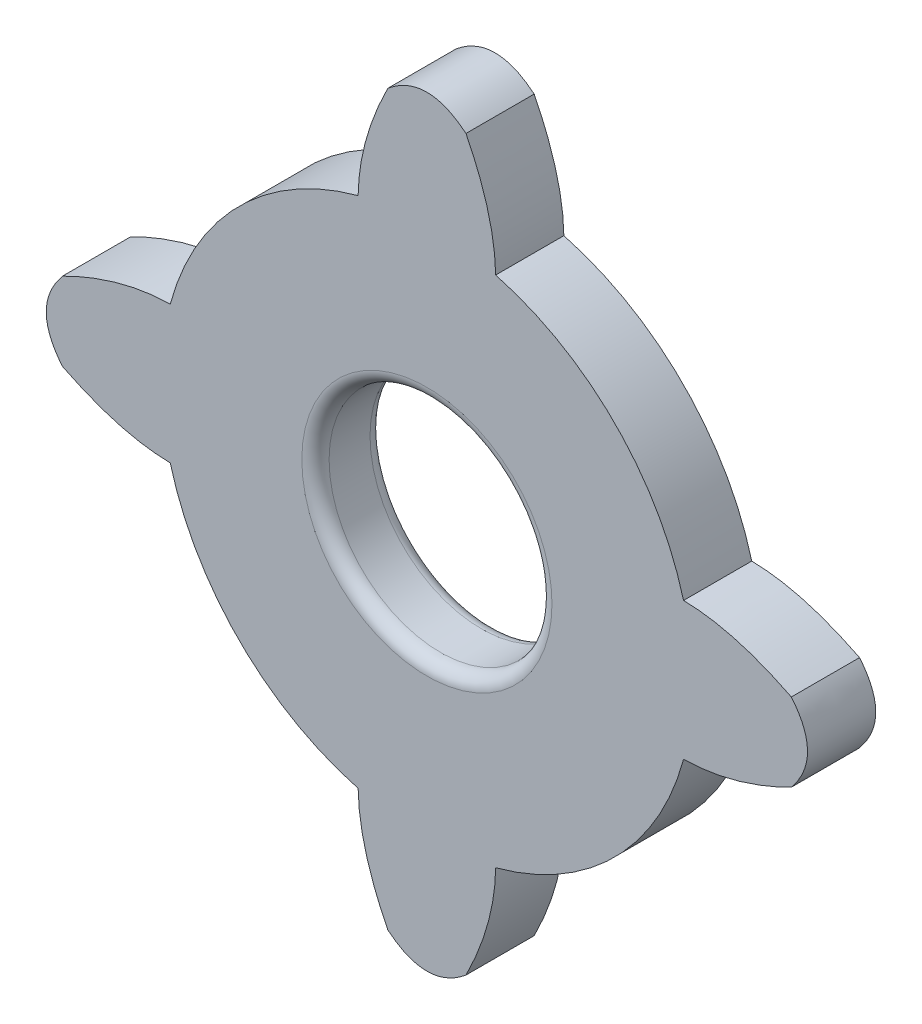
ISO-10303-21;
HEADER;
FILE_DESCRIPTION(('STEP AP214'),'2;1');
FILE_NAME('part.step','',(''),(''),'','','');
FILE_SCHEMA(('AUTOMOTIVE_DESIGN { 1 0 10303 214 1 1 1 1 }'));
ENDSEC;
DATA;
#1=APPLICATION_CONTEXT('core data for automotive mechanical design processes');
#2=APPLICATION_PROTOCOL_DEFINITION('international standard','automotive_design',2000,#1);
#3=PRODUCT_CONTEXT('',#1,'mechanical');
#4=PRODUCT('Part','Part','',(#3));
#5=PRODUCT_RELATED_PRODUCT_CATEGORY('part','',(#4));
#6=PRODUCT_DEFINITION_FORMATION('','',#4);
#7=PRODUCT_DEFINITION_CONTEXT('part definition',#1,'design');
#8=PRODUCT_DEFINITION('design','',#6,#7);
#9=PRODUCT_DEFINITION_SHAPE('','',#8);
#10=(LENGTH_UNIT() NAMED_UNIT(*) SI_UNIT(.MILLI.,.METRE.));
#11=(NAMED_UNIT(*) PLANE_ANGLE_UNIT() SI_UNIT($,.RADIAN.));
#12=(NAMED_UNIT(*) SI_UNIT($,.STERADIAN.) SOLID_ANGLE_UNIT());
#13=UNCERTAINTY_MEASURE_WITH_UNIT(LENGTH_MEASURE(1.E-05),#10,'distance_accuracy_value','');
#14=(GEOMETRIC_REPRESENTATION_CONTEXT(3) GLOBAL_UNCERTAINTY_ASSIGNED_CONTEXT((#13)) GLOBAL_UNIT_ASSIGNED_CONTEXT((#10,
#11,#12)) REPRESENTATION_CONTEXT('',''));
#15=CARTESIAN_POINT('',(0.,0.,0.));
#16=DIRECTION('',(0.,0.,1.));
#17=DIRECTION('',(1.,0.,0.));
#18=AXIS2_PLACEMENT_3D('',#15,#16,#17);
#19=CARTESIAN_POINT('',(0.,0.,8.));
#20=DIRECTION('',(0.,0.,-1.));
#21=DIRECTION('',(-1.,0.,0.));
#22=AXIS2_PLACEMENT_3D('',#19,#20,#21);
#23=TOROIDAL_SURFACE('',#22,18.3420336323127,2.);
#24=CARTESIAN_POINT('',(0.,0.,10.));
#25=DIRECTION('',(0.,0.,-1.));
#26=DIRECTION('',(-1.,0.,0.));
#27=AXIS2_PLACEMENT_3D('',#24,#25,#26);
#28=CIRCLE('',#27,18.3420336323127);
#29=CARTESIAN_POINT('',(-18.3420336323127,0.,10.));
#30=VERTEX_POINT('',#29);
#31=EDGE_CURVE('E43',#30,#30,#28,.T.);
#32=ORIENTED_EDGE('',*,*,#31,.F.);
#33=EDGE_LOOP('',(#32));
#34=FACE_BOUND('',#33,.T.);
#35=CARTESIAN_POINT('',(0.,0.,8.));
#36=DIRECTION('',(0.,0.,-1.));
#37=DIRECTION('',(-1.,0.,0.));
#38=AXIS2_PLACEMENT_3D('',#35,#36,#37);
#39=CIRCLE('',#38,16.3420336323127);
#40=CARTESIAN_POINT('',(-16.3420336323127,0.,8.));
#41=VERTEX_POINT('',#40);
#42=EDGE_CURVE('E11',#41,#41,#39,.F.);
#43=ORIENTED_EDGE('',*,*,#42,.F.);
#44=EDGE_LOOP('',(#43));
#45=FACE_BOUND('',#44,.T.);
#46=ADVANCED_FACE('F35',(#34,#45),#23,.T.);
#47=CARTESIAN_POINT('',(0.,0.,2.));
#48=DIRECTION('',(0.,0.,-1.));
#49=DIRECTION('',(-1.,0.,0.));
#50=AXIS2_PLACEMENT_3D('',#47,#48,#49);
#51=TOROIDAL_SURFACE('',#50,18.3420336323127,2.);
#52=CARTESIAN_POINT('',(0.,0.,0.));
#53=DIRECTION('',(0.,0.,-1.));
#54=DIRECTION('',(-1.,0.,0.));
#55=AXIS2_PLACEMENT_3D('',#52,#53,#54);
#56=CIRCLE('',#55,18.3420336323127);
#57=CARTESIAN_POINT('',(-18.3420336323127,0.,0.));
#58=VERTEX_POINT('',#57);
#59=EDGE_CURVE('E377',#58,#58,#56,.F.);
#60=ORIENTED_EDGE('',*,*,#59,.F.);
#61=EDGE_LOOP('',(#60));
#62=FACE_BOUND('',#61,.T.);
#63=CARTESIAN_POINT('',(0.,0.,2.));
#64=DIRECTION('',(0.,0.,-1.));
#65=DIRECTION('',(-1.,0.,0.));
#66=AXIS2_PLACEMENT_3D('',#63,#64,#65);
#67=CIRCLE('',#66,16.3420336323127);
#68=CARTESIAN_POINT('',(-16.3420336323127,0.,2.));
#69=VERTEX_POINT('',#68);
#70=EDGE_CURVE('E380',#69,#69,#67,.T.);
#71=ORIENTED_EDGE('',*,*,#70,.F.);
#72=EDGE_LOOP('',(#71));
#73=FACE_BOUND('',#72,.T.);
#74=ADVANCED_FACE('F318',(#62,#73),#51,.T.);
#75=CARTESIAN_POINT('',(-8.94182744697967,45.2711424794401,10.));
#76=DIRECTION('',(0.,0.,-1.));
#77=DIRECTION('',(-1.,0.,0.));
#78=AXIS2_PLACEMENT_3D('',#75,#76,#77);
#79=PLANE('',#78);
#80=ORIENTED_EDGE('',*,*,#31,.T.);
#81=EDGE_LOOP('',(#80));
#82=FACE_BOUND('',#81,.T.);
#83=CARTESIAN_POINT('',(-5.73037982205596,53.4351143016469,10.));
#84=CARTESIAN_POINT('',(-9.97699774629384,45.0097159362313,10.));
#85=CARTESIAN_POINT('',(-10.0829344732751,37.6300237436507,10.));
#86=B_SPLINE_CURVE_WITH_KNOTS('',2,(#83,#84,#85),.UNSPECIFIED.,.F.,.F.,(3,3),(0.,1.),.UNSPECIFIED.);
#87=CARTESIAN_POINT('',(-5.73037982205596,53.4351143016469,10.));
#88=VERTEX_POINT('',#87);
#89=CARTESIAN_POINT('',(-10.0829344732751,37.6300237436507,10.));
#90=VERTEX_POINT('',#89);
#91=EDGE_CURVE('E319',#88,#90,#86,.T.);
#92=ORIENTED_EDGE('',*,*,#91,.T.);
#93=CARTESIAN_POINT('',(0.,0.,10.));
#94=DIRECTION('',(0.,0.,1.));
#95=DIRECTION('',(1.,0.,0.));
#96=AXIS2_PLACEMENT_3D('',#93,#94,#95);
#97=CIRCLE('',#96,38.9574672500674);
#98=CARTESIAN_POINT('',(-37.6300237436507,10.0829344732751,10.));
#99=VERTEX_POINT('',#98);
#100=EDGE_CURVE('E119',#90,#99,#97,.T.);
#101=ORIENTED_EDGE('',*,*,#100,.T.);
#102=CARTESIAN_POINT('',(-37.6300237436507,10.0829344732751,10.));
#103=CARTESIAN_POINT('',(-45.0097159362313,9.97699774629384,10.));
#104=CARTESIAN_POINT('',(-53.4351143016469,5.73037982205596,10.));
#105=B_SPLINE_CURVE_WITH_KNOTS('',2,(#102,#103,#104),.UNSPECIFIED.,.F.,.F.,(3,3),(0.,1.),.UNSPECIFIED.);
#106=CARTESIAN_POINT('',(-53.4351143016469,5.73037982205596,10.));
#107=VERTEX_POINT('',#106);
#108=EDGE_CURVE('E295',#99,#107,#105,.T.);
#109=ORIENTED_EDGE('',*,*,#108,.T.);
#110=CARTESIAN_POINT('',(-53.4351143016469,5.73037982205596,10.));
#111=CARTESIAN_POINT('',(-58.1785357397927,0.,10.));
#112=CARTESIAN_POINT('',(-53.4351143016469,-5.73037982205595,10.));
#113=B_SPLINE_CURVE_WITH_KNOTS('',2,(#110,#111,#112),.UNSPECIFIED.,.F.,.F.,(3,3),(0.,1.),.UNSPECIFIED.);
#114=CARTESIAN_POINT('',(-53.4351143016469,-5.73037982205595,10.));
#115=VERTEX_POINT('',#114);
#116=EDGE_CURVE('E287',#107,#115,#113,.T.);
#117=ORIENTED_EDGE('',*,*,#116,.T.);
#118=CARTESIAN_POINT('',(-53.4351143016469,-5.73037982205595,10.));
#119=CARTESIAN_POINT('',(-45.0097159362313,-9.97699774629384,10.));
#120=CARTESIAN_POINT('',(-37.6300237436507,-10.0829344732751,10.));
#121=B_SPLINE_CURVE_WITH_KNOTS('',2,(#118,#119,#120),.UNSPECIFIED.,.F.,.F.,(3,3),(0.,1.),.UNSPECIFIED.);
#122=CARTESIAN_POINT('',(-37.6300237436507,-10.082934473275,10.));
#123=VERTEX_POINT('',#122);
#124=EDGE_CURVE('E283',#115,#123,#121,.T.);
#125=ORIENTED_EDGE('',*,*,#124,.T.);
#126=CARTESIAN_POINT('',(0.,0.,10.));
#127=DIRECTION('',(0.,0.,1.));
#128=DIRECTION('',(1.,0.,0.));
#129=AXIS2_PLACEMENT_3D('',#126,#127,#128);
#130=CIRCLE('',#129,38.9574672500674);
#131=CARTESIAN_POINT('',(-10.0829344732751,-37.6300237436507,10.));
#132=VERTEX_POINT('',#131);
#133=EDGE_CURVE('E263',#123,#132,#130,.T.);
#134=ORIENTED_EDGE('',*,*,#133,.T.);
#135=CARTESIAN_POINT('',(-10.0829344732751,-37.6300237436507,10.));
#136=CARTESIAN_POINT('',(-9.97699774629383,-45.0097159362313,10.));
#137=CARTESIAN_POINT('',(-5.73037982205595,-53.4351143016469,10.));
#138=B_SPLINE_CURVE_WITH_KNOTS('',2,(#135,#136,#137),.UNSPECIFIED.,.F.,.F.,(3,3),(0.,1.),.UNSPECIFIED.);
#139=CARTESIAN_POINT('',(-5.73037982205595,-53.4351143016469,10.));
#140=VERTEX_POINT('',#139);
#141=EDGE_CURVE('E255',#132,#140,#138,.T.);
#142=ORIENTED_EDGE('',*,*,#141,.T.);
#143=CARTESIAN_POINT('',(-5.73037982205595,-53.4351143016469,10.));
#144=CARTESIAN_POINT('',(0.,-58.1785357397927,10.));
#145=CARTESIAN_POINT('',(5.73037982205597,-53.4351143016469,10.));
#146=B_SPLINE_CURVE_WITH_KNOTS('',2,(#143,#144,#145),.UNSPECIFIED.,.F.,.F.,(3,3),(0.,1.),.UNSPECIFIED.);
#147=CARTESIAN_POINT('',(5.73037982205597,-53.4351143016469,10.));
#148=VERTEX_POINT('',#147);
#149=EDGE_CURVE('E247',#140,#148,#146,.T.);
#150=ORIENTED_EDGE('',*,*,#149,.T.);
#151=CARTESIAN_POINT('',(5.73037982205597,-53.4351143016469,10.));
#152=CARTESIAN_POINT('',(9.97699774629385,-45.0097159362313,10.));
#153=CARTESIAN_POINT('',(10.0829344732751,-37.6300237436507,10.));
#154=B_SPLINE_CURVE_WITH_KNOTS('',2,(#151,#152,#153),.UNSPECIFIED.,.F.,.F.,(3,3),(0.,1.),.UNSPECIFIED.);
#155=CARTESIAN_POINT('',(10.082934473275,-37.6300237436507,10.));
#156=VERTEX_POINT('',#155);
#157=EDGE_CURVE('E243',#148,#156,#154,.T.);
#158=ORIENTED_EDGE('',*,*,#157,.T.);
#159=CARTESIAN_POINT('',(0.,0.,10.));
#160=DIRECTION('',(0.,0.,1.));
#161=DIRECTION('',(1.,0.,0.));
#162=AXIS2_PLACEMENT_3D('',#159,#160,#161);
#163=CIRCLE('',#162,38.9574672500674);
#164=CARTESIAN_POINT('',(37.6300237436507,-10.0829344732751,10.));
#165=VERTEX_POINT('',#164);
#166=EDGE_CURVE('E223',#156,#165,#163,.T.);
#167=ORIENTED_EDGE('',*,*,#166,.T.);
#168=CARTESIAN_POINT('',(37.6300237436507,-10.0829344732751,10.));
#169=CARTESIAN_POINT('',(45.0097159362313,-9.97699774629384,10.));
#170=CARTESIAN_POINT('',(53.4351143016469,-5.73037982205595,10.));
#171=B_SPLINE_CURVE_WITH_KNOTS('',2,(#168,#169,#170),.UNSPECIFIED.,.F.,.F.,(3,3),(0.,1.),.UNSPECIFIED.);
#172=CARTESIAN_POINT('',(53.4351143016469,-5.73037982205595,10.));
#173=VERTEX_POINT('',#172);
#174=EDGE_CURVE('E215',#165,#173,#171,.T.);
#175=ORIENTED_EDGE('',*,*,#174,.T.);
#176=CARTESIAN_POINT('',(53.4351143016469,-5.73037982205595,10.));
#177=CARTESIAN_POINT('',(58.1785357397927,0.,10.));
#178=CARTESIAN_POINT('',(53.4351143016469,5.73037982205596,10.));
#179=B_SPLINE_CURVE_WITH_KNOTS('',2,(#176,#177,#178),.UNSPECIFIED.,.F.,.F.,(3,3),(0.,1.),.UNSPECIFIED.);
#180=CARTESIAN_POINT('',(53.4351143016469,5.73037982205596,10.));
#181=VERTEX_POINT('',#180);
#182=EDGE_CURVE('E207',#173,#181,#179,.T.);
#183=ORIENTED_EDGE('',*,*,#182,.T.);
#184=CARTESIAN_POINT('',(53.4351143016469,5.73037982205596,10.));
#185=CARTESIAN_POINT('',(45.0097159362313,9.97699774629384,10.));
#186=CARTESIAN_POINT('',(37.6300237436507,10.0829344732751,10.));
#187=B_SPLINE_CURVE_WITH_KNOTS('',2,(#184,#185,#186),.UNSPECIFIED.,.F.,.F.,(3,3),(0.,1.),.UNSPECIFIED.);
#188=CARTESIAN_POINT('',(37.6300237436507,10.0829344732751,10.));
#189=VERTEX_POINT('',#188);
#190=EDGE_CURVE('E162',#181,#189,#187,.T.);
#191=ORIENTED_EDGE('',*,*,#190,.T.);
#192=CARTESIAN_POINT('',(0.,0.,10.));
#193=DIRECTION('',(0.,0.,1.));
#194=DIRECTION('',(1.,0.,0.));
#195=AXIS2_PLACEMENT_3D('',#192,#193,#194);
#196=CIRCLE('',#195,38.9574672500674);
#197=CARTESIAN_POINT('',(10.0829344732751,37.6300237436507,10.));
#198=VERTEX_POINT('',#197);
#199=EDGE_CURVE('E156',#189,#198,#196,.T.);
#200=ORIENTED_EDGE('',*,*,#199,.T.);
#201=CARTESIAN_POINT('',(10.0829344732751,37.6300237436507,10.));
#202=CARTESIAN_POINT('',(9.97699774629384,45.0097159362313,10.));
#203=CARTESIAN_POINT('',(5.73037982205596,53.4351143016469,10.));
#204=B_SPLINE_CURVE_WITH_KNOTS('',2,(#201,#202,#203),.UNSPECIFIED.,.F.,.F.,(3,3),(0.,1.),.UNSPECIFIED.);
#205=CARTESIAN_POINT('',(5.73037982205596,53.4351143016469,10.));
#206=VERTEX_POINT('',#205);
#207=EDGE_CURVE('E160',#198,#206,#204,.T.);
#208=ORIENTED_EDGE('',*,*,#207,.T.);
#209=CARTESIAN_POINT('',(5.73037982205596,53.4351143016469,10.));
#210=CARTESIAN_POINT('',(0.,58.1785357397927,10.));
#211=CARTESIAN_POINT('',(-5.73037982205596,53.4351143016469,10.));
#212=B_SPLINE_CURVE_WITH_KNOTS('',2,(#209,#210,#211),.UNSPECIFIED.,.F.,.F.,(3,3),(0.,1.),.UNSPECIFIED.);
#213=EDGE_CURVE('E51',#206,#88,#212,.T.);
#214=ORIENTED_EDGE('',*,*,#213,.T.);
#215=EDGE_LOOP('',(#92,#101,#109,#117,#125,#134,#142,#150,#158,#167,#175,#183,#191,#200,#208,#214));
#216=FACE_BOUND('',#215,.T.);
#217=ADVANCED_FACE('F158',(#82,#216),#79,.F.);
#218=CARTESIAN_POINT('',(-8.94182744697967,45.2711424794401,0.));
#219=DIRECTION('',(0.,0.,-1.));
#220=DIRECTION('',(-1.,0.,0.));
#221=AXIS2_PLACEMENT_3D('',#218,#219,#220);
#222=PLANE('',#221);
#223=ORIENTED_EDGE('',*,*,#59,.T.);
#224=EDGE_LOOP('',(#223));
#225=FACE_BOUND('',#224,.T.);
#226=CARTESIAN_POINT('',(-5.73037982205596,53.4351143016469,0.));
#227=CARTESIAN_POINT('',(-9.97699774629384,45.0097159362313,0.));
#228=CARTESIAN_POINT('',(-10.0829344732751,37.6300237436507,0.));
#229=B_SPLINE_CURVE_WITH_KNOTS('',2,(#226,#227,#228),.UNSPECIFIED.,.F.,.F.,(3,3),(0.,1.),.UNSPECIFIED.);
#230=CARTESIAN_POINT('',(-5.73037982205596,53.4351143016469,0.));
#231=VERTEX_POINT('',#230);
#232=CARTESIAN_POINT('',(-10.0829344732751,37.6300237436507,0.));
#233=VERTEX_POINT('',#232);
#234=EDGE_CURVE('E408',#231,#233,#229,.T.);
#235=ORIENTED_EDGE('',*,*,#234,.F.);
#236=CARTESIAN_POINT('',(5.73037982205596,53.4351143016469,0.));
#237=CARTESIAN_POINT('',(0.,58.1785357397927,0.));
#238=CARTESIAN_POINT('',(-5.73037982205596,53.4351143016469,0.));
#239=B_SPLINE_CURVE_WITH_KNOTS('',2,(#236,#237,#238),.UNSPECIFIED.,.F.,.F.,(3,3),(0.,1.),.UNSPECIFIED.);
#240=CARTESIAN_POINT('',(5.73037982205596,53.4351143016469,0.));
#241=VERTEX_POINT('',#240);
#242=EDGE_CURVE('E110',#241,#231,#239,.T.);
#243=ORIENTED_EDGE('',*,*,#242,.F.);
#244=CARTESIAN_POINT('',(10.0829344732751,37.6300237436507,0.));
#245=CARTESIAN_POINT('',(9.97699774629384,45.0097159362313,0.));
#246=CARTESIAN_POINT('',(5.73037982205596,53.4351143016469,0.));
#247=B_SPLINE_CURVE_WITH_KNOTS('',2,(#244,#245,#246),.UNSPECIFIED.,.F.,.F.,(3,3),(0.,1.),.UNSPECIFIED.);
#248=CARTESIAN_POINT('',(10.0829344732751,37.6300237436507,0.));
#249=VERTEX_POINT('',#248);
#250=EDGE_CURVE('E104',#249,#241,#247,.T.);
#251=ORIENTED_EDGE('',*,*,#250,.F.);
#252=CARTESIAN_POINT('',(0.,0.,0.));
#253=DIRECTION('',(0.,0.,1.));
#254=DIRECTION('',(1.,0.,0.));
#255=AXIS2_PLACEMENT_3D('',#252,#253,#254);
#256=CIRCLE('',#255,38.9574672500674);
#257=CARTESIAN_POINT('',(37.6300237436507,10.0829344732751,0.));
#258=VERTEX_POINT('',#257);
#259=EDGE_CURVE('E170',#258,#249,#256,.T.);
#260=ORIENTED_EDGE('',*,*,#259,.F.);
#261=CARTESIAN_POINT('',(53.4351143016469,5.73037982205596,0.));
#262=CARTESIAN_POINT('',(45.0097159362313,9.97699774629384,0.));
#263=CARTESIAN_POINT('',(37.6300237436507,10.0829344732751,0.));
#264=B_SPLINE_CURVE_WITH_KNOTS('',2,(#261,#262,#263),.UNSPECIFIED.,.F.,.F.,(3,3),(0.,1.),.UNSPECIFIED.);
#265=CARTESIAN_POINT('',(53.4351143016469,5.73037982205596,0.));
#266=VERTEX_POINT('',#265);
#267=EDGE_CURVE('E475',#266,#258,#264,.T.);
#268=ORIENTED_EDGE('',*,*,#267,.F.);
#269=CARTESIAN_POINT('',(53.4351143016469,-5.73037982205595,0.));
#270=CARTESIAN_POINT('',(58.1785357397927,0.,0.));
#271=CARTESIAN_POINT('',(53.4351143016469,5.73037982205596,0.));
#272=B_SPLINE_CURVE_WITH_KNOTS('',2,(#269,#270,#271),.UNSPECIFIED.,.F.,.F.,(3,3),(0.,1.),.UNSPECIFIED.);
#273=CARTESIAN_POINT('',(53.4351143016469,-5.73037982205595,0.));
#274=VERTEX_POINT('',#273);
#275=EDGE_CURVE('E468',#274,#266,#272,.T.);
#276=ORIENTED_EDGE('',*,*,#275,.F.);
#277=CARTESIAN_POINT('',(37.6300237436507,-10.0829344732751,0.));
#278=CARTESIAN_POINT('',(45.0097159362313,-9.97699774629384,0.));
#279=CARTESIAN_POINT('',(53.4351143016469,-5.73037982205595,0.));
#280=B_SPLINE_CURVE_WITH_KNOTS('',2,(#277,#278,#279),.UNSPECIFIED.,.F.,.F.,(3,3),(0.,1.),.UNSPECIFIED.);
#281=CARTESIAN_POINT('',(37.6300237436507,-10.0829344732751,0.));
#282=VERTEX_POINT('',#281);
#283=EDGE_CURVE('E464',#282,#274,#280,.T.);
#284=ORIENTED_EDGE('',*,*,#283,.F.);
#285=CARTESIAN_POINT('',(0.,0.,0.));
#286=DIRECTION('',(0.,0.,1.));
#287=DIRECTION('',(1.,0.,0.));
#288=AXIS2_PLACEMENT_3D('',#285,#286,#287);
#289=CIRCLE('',#288,38.9574672500674);
#290=CARTESIAN_POINT('',(10.082934473275,-37.6300237436507,0.));
#291=VERTEX_POINT('',#290);
#292=EDGE_CURVE('E459',#291,#282,#289,.T.);
#293=ORIENTED_EDGE('',*,*,#292,.F.);
#294=CARTESIAN_POINT('',(5.73037982205597,-53.4351143016469,0.));
#295=CARTESIAN_POINT('',(9.97699774629385,-45.0097159362313,0.));
#296=CARTESIAN_POINT('',(10.0829344732751,-37.6300237436507,0.));
#297=B_SPLINE_CURVE_WITH_KNOTS('',2,(#294,#295,#296),.UNSPECIFIED.,.F.,.F.,(3,3),(0.,1.),.UNSPECIFIED.);
#298=CARTESIAN_POINT('',(5.73037982205597,-53.4351143016469,0.));
#299=VERTEX_POINT('',#298);
#300=EDGE_CURVE('E452',#299,#291,#297,.T.);
#301=ORIENTED_EDGE('',*,*,#300,.F.);
#302=CARTESIAN_POINT('',(-5.73037982205595,-53.4351143016469,0.));
#303=CARTESIAN_POINT('',(0.,-58.1785357397927,0.));
#304=CARTESIAN_POINT('',(5.73037982205597,-53.4351143016469,0.));
#305=B_SPLINE_CURVE_WITH_KNOTS('',2,(#302,#303,#304),.UNSPECIFIED.,.F.,.F.,(3,3),(0.,1.),.UNSPECIFIED.);
#306=CARTESIAN_POINT('',(-5.73037982205595,-53.4351143016469,0.));
#307=VERTEX_POINT('',#306);
#308=EDGE_CURVE('E445',#307,#299,#305,.T.);
#309=ORIENTED_EDGE('',*,*,#308,.F.);
#310=CARTESIAN_POINT('',(-10.0829344732751,-37.6300237436507,0.));
#311=CARTESIAN_POINT('',(-9.97699774629383,-45.0097159362313,0.));
#312=CARTESIAN_POINT('',(-5.73037982205595,-53.4351143016469,0.));
#313=B_SPLINE_CURVE_WITH_KNOTS('',2,(#310,#311,#312),.UNSPECIFIED.,.F.,.F.,(3,3),(0.,1.),.UNSPECIFIED.);
#314=CARTESIAN_POINT('',(-10.0829344732751,-37.6300237436507,0.));
#315=VERTEX_POINT('',#314);
#316=EDGE_CURVE('E441',#315,#307,#313,.T.);
#317=ORIENTED_EDGE('',*,*,#316,.F.);
#318=CARTESIAN_POINT('',(0.,0.,0.));
#319=DIRECTION('',(0.,0.,1.));
#320=DIRECTION('',(1.,0.,0.));
#321=AXIS2_PLACEMENT_3D('',#318,#319,#320);
#322=CIRCLE('',#321,38.9574672500674);
#323=CARTESIAN_POINT('',(-37.6300237436507,-10.082934473275,0.));
#324=VERTEX_POINT('',#323);
#325=EDGE_CURVE('E436',#324,#315,#322,.T.);
#326=ORIENTED_EDGE('',*,*,#325,.F.);
#327=CARTESIAN_POINT('',(-53.4351143016469,-5.73037982205595,0.));
#328=CARTESIAN_POINT('',(-45.0097159362313,-9.97699774629384,0.));
#329=CARTESIAN_POINT('',(-37.6300237436507,-10.0829344732751,0.));
#330=B_SPLINE_CURVE_WITH_KNOTS('',2,(#327,#328,#329),.UNSPECIFIED.,.F.,.F.,(3,3),(0.,1.),.UNSPECIFIED.);
#331=CARTESIAN_POINT('',(-53.4351143016469,-5.73037982205595,0.));
#332=VERTEX_POINT('',#331);
#333=EDGE_CURVE('E429',#332,#324,#330,.T.);
#334=ORIENTED_EDGE('',*,*,#333,.F.);
#335=CARTESIAN_POINT('',(-53.4351143016469,5.73037982205596,0.));
#336=CARTESIAN_POINT('',(-58.1785357397927,0.,0.));
#337=CARTESIAN_POINT('',(-53.4351143016469,-5.73037982205595,0.));
#338=B_SPLINE_CURVE_WITH_KNOTS('',2,(#335,#336,#337),.UNSPECIFIED.,.F.,.F.,(3,3),(0.,1.),.UNSPECIFIED.);
#339=CARTESIAN_POINT('',(-53.4351143016469,5.73037982205596,0.));
#340=VERTEX_POINT('',#339);
#341=EDGE_CURVE('E422',#340,#332,#338,.T.);
#342=ORIENTED_EDGE('',*,*,#341,.F.);
#343=CARTESIAN_POINT('',(-37.6300237436507,10.0829344732751,0.));
#344=CARTESIAN_POINT('',(-45.0097159362313,9.97699774629384,0.));
#345=CARTESIAN_POINT('',(-53.4351143016469,5.73037982205596,0.));
#346=B_SPLINE_CURVE_WITH_KNOTS('',2,(#343,#344,#345),.UNSPECIFIED.,.F.,.F.,(3,3),(0.,1.),.UNSPECIFIED.);
#347=CARTESIAN_POINT('',(-37.6300237436507,10.0829344732751,0.));
#348=VERTEX_POINT('',#347);
#349=EDGE_CURVE('E411',#348,#340,#346,.T.);
#350=ORIENTED_EDGE('',*,*,#349,.F.);
#351=CARTESIAN_POINT('',(0.,0.,0.));
#352=DIRECTION('',(0.,0.,1.));
#353=DIRECTION('',(1.,0.,0.));
#354=AXIS2_PLACEMENT_3D('',#351,#352,#353);
#355=CIRCLE('',#354,38.9574672500674);
#356=EDGE_CURVE('E410',#233,#348,#355,.T.);
#357=ORIENTED_EDGE('',*,*,#356,.F.);
#358=EDGE_LOOP('',(#235,#243,#251,#260,#268,#276,#284,#293,#301,#309,#317,#326,#334,#342,#350,#357));
#359=FACE_BOUND('',#358,.T.);
#360=ADVANCED_FACE('F316',(#225,#359),#222,.T.);
#361=DIRECTION('',(0.,0.,-1.));
#362=VECTOR('',#361,1.);
#363=SURFACE_OF_LINEAR_EXTRUSION('',#86,#362);
#364=ORIENTED_EDGE('',*,*,#234,.T.);
#365=DIRECTION('',(0.,0.,-1.));
#366=VECTOR('',#365,1.);
#367=CARTESIAN_POINT('',(-10.0829344732751,37.6300237436507,10.));
#368=LINE('',#367,#366);
#369=EDGE_CURVE('E375',#90,#233,#368,.T.);
#370=ORIENTED_EDGE('',*,*,#369,.F.);
#371=ORIENTED_EDGE('',*,*,#91,.F.);
#372=DIRECTION('',(0.,0.,-1.));
#373=VECTOR('',#372,1.);
#374=CARTESIAN_POINT('',(-5.73037982205596,53.4351143016469,10.));
#375=LINE('',#374,#373);
#376=EDGE_CURVE('E176',#88,#231,#375,.T.);
#377=ORIENTED_EDGE('',*,*,#376,.T.);
#378=EDGE_LOOP('',(#364,#370,#371,#377));
#379=FACE_BOUND('',#378,.T.);
#380=ADVANCED_FACE('F314',(#379),#363,.F.);
#381=CARTESIAN_POINT('',(0.,0.,10.));
#382=DIRECTION('',(0.,0.,-1.));
#383=DIRECTION('',(-1.,0.,0.));
#384=AXIS2_PLACEMENT_3D('',#381,#382,#383);
#385=CYLINDRICAL_SURFACE('',#384,38.9574672500674);
#386=ORIENTED_EDGE('',*,*,#356,.T.);
#387=DIRECTION('',(0.,0.,-1.));
#388=VECTOR('',#387,1.);
#389=CARTESIAN_POINT('',(-37.6300237436507,10.0829344732751,10.));
#390=LINE('',#389,#388);
#391=EDGE_CURVE('E372',#99,#348,#390,.T.);
#392=ORIENTED_EDGE('',*,*,#391,.F.);
#393=ORIENTED_EDGE('',*,*,#100,.F.);
#394=ORIENTED_EDGE('',*,*,#369,.T.);
#395=EDGE_LOOP('',(#386,#392,#393,#394));
#396=FACE_BOUND('',#395,.T.);
#397=ADVANCED_FACE('F310',(#396),#385,.T.);
#398=DIRECTION('',(0.,0.,-1.));
#399=VECTOR('',#398,1.);
#400=SURFACE_OF_LINEAR_EXTRUSION('',#105,#399);
#401=ORIENTED_EDGE('',*,*,#349,.T.);
#402=DIRECTION('',(0.,0.,-1.));
#403=VECTOR('',#402,1.);
#404=CARTESIAN_POINT('',(-53.4351143016469,5.73037982205596,10.));
#405=LINE('',#404,#403);
#406=EDGE_CURVE('E369',#107,#340,#405,.T.);
#407=ORIENTED_EDGE('',*,*,#406,.F.);
#408=ORIENTED_EDGE('',*,*,#108,.F.);
#409=ORIENTED_EDGE('',*,*,#391,.T.);
#410=EDGE_LOOP('',(#401,#407,#408,#409));
#411=FACE_BOUND('',#410,.T.);
#412=ADVANCED_FACE('F307',(#411),#400,.F.);
#413=DIRECTION('',(0.,0.,-1.));
#414=VECTOR('',#413,1.);
#415=SURFACE_OF_LINEAR_EXTRUSION('',#113,#414);
#416=ORIENTED_EDGE('',*,*,#341,.T.);
#417=DIRECTION('',(0.,0.,-1.));
#418=VECTOR('',#417,1.);
#419=CARTESIAN_POINT('',(-53.4351143016469,-5.73037982205595,10.));
#420=LINE('',#419,#418);
#421=EDGE_CURVE('E366',#115,#332,#420,.T.);
#422=ORIENTED_EDGE('',*,*,#421,.F.);
#423=ORIENTED_EDGE('',*,*,#116,.F.);
#424=ORIENTED_EDGE('',*,*,#406,.T.);
#425=EDGE_LOOP('',(#416,#422,#423,#424));
#426=FACE_BOUND('',#425,.T.);
#427=ADVANCED_FACE('F279',(#426),#415,.F.);
#428=DIRECTION('',(0.,0.,-1.));
#429=VECTOR('',#428,1.);
#430=SURFACE_OF_LINEAR_EXTRUSION('',#121,#429);
#431=ORIENTED_EDGE('',*,*,#333,.T.);
#432=DIRECTION('',(0.,0.,-1.));
#433=VECTOR('',#432,1.);
#434=CARTESIAN_POINT('',(-37.6300237436507,-10.082934473275,10.));
#435=LINE('',#434,#433);
#436=EDGE_CURVE('E363',#123,#324,#435,.T.);
#437=ORIENTED_EDGE('',*,*,#436,.F.);
#438=ORIENTED_EDGE('',*,*,#124,.F.);
#439=ORIENTED_EDGE('',*,*,#421,.T.);
#440=EDGE_LOOP('',(#431,#437,#438,#439));
#441=FACE_BOUND('',#440,.T.);
#442=ADVANCED_FACE('F275',(#441),#430,.F.);
#443=CARTESIAN_POINT('',(0.,0.,10.));
#444=DIRECTION('',(0.,0.,-1.));
#445=DIRECTION('',(-1.,0.,0.));
#446=AXIS2_PLACEMENT_3D('',#443,#444,#445);
#447=CYLINDRICAL_SURFACE('',#446,38.9574672500674);
#448=ORIENTED_EDGE('',*,*,#325,.T.);
#449=DIRECTION('',(0.,0.,-1.));
#450=VECTOR('',#449,1.);
#451=CARTESIAN_POINT('',(-10.0829344732751,-37.6300237436507,10.));
#452=LINE('',#451,#450);
#453=EDGE_CURVE('E360',#132,#315,#452,.T.);
#454=ORIENTED_EDGE('',*,*,#453,.F.);
#455=ORIENTED_EDGE('',*,*,#133,.F.);
#456=ORIENTED_EDGE('',*,*,#436,.T.);
#457=EDGE_LOOP('',(#448,#454,#455,#456));
#458=FACE_BOUND('',#457,.T.);
#459=ADVANCED_FACE('F271',(#458),#447,.T.);
#460=DIRECTION('',(0.,0.,-1.));
#461=VECTOR('',#460,1.);
#462=SURFACE_OF_LINEAR_EXTRUSION('',#138,#461);
#463=ORIENTED_EDGE('',*,*,#316,.T.);
#464=DIRECTION('',(0.,0.,-1.));
#465=VECTOR('',#464,1.);
#466=CARTESIAN_POINT('',(-5.73037982205595,-53.4351143016469,10.));
#467=LINE('',#466,#465);
#468=EDGE_CURVE('E357',#140,#307,#467,.T.);
#469=ORIENTED_EDGE('',*,*,#468,.F.);
#470=ORIENTED_EDGE('',*,*,#141,.F.);
#471=ORIENTED_EDGE('',*,*,#453,.T.);
#472=EDGE_LOOP('',(#463,#469,#470,#471));
#473=FACE_BOUND('',#472,.T.);
#474=ADVANCED_FACE('F268',(#473),#462,.F.);
#475=DIRECTION('',(0.,0.,-1.));
#476=VECTOR('',#475,1.);
#477=SURFACE_OF_LINEAR_EXTRUSION('',#146,#476);
#478=ORIENTED_EDGE('',*,*,#308,.T.);
#479=DIRECTION('',(0.,0.,-1.));
#480=VECTOR('',#479,1.);
#481=CARTESIAN_POINT('',(5.73037982205597,-53.4351143016469,10.));
#482=LINE('',#481,#480);
#483=EDGE_CURVE('E354',#148,#299,#482,.T.);
#484=ORIENTED_EDGE('',*,*,#483,.F.);
#485=ORIENTED_EDGE('',*,*,#149,.F.);
#486=ORIENTED_EDGE('',*,*,#468,.T.);
#487=EDGE_LOOP('',(#478,#484,#485,#486));
#488=FACE_BOUND('',#487,.T.);
#489=ADVANCED_FACE('F239',(#488),#477,.F.);
#490=DIRECTION('',(0.,0.,-1.));
#491=VECTOR('',#490,1.);
#492=SURFACE_OF_LINEAR_EXTRUSION('',#154,#491);
#493=ORIENTED_EDGE('',*,*,#300,.T.);
#494=DIRECTION('',(0.,0.,-1.));
#495=VECTOR('',#494,1.);
#496=CARTESIAN_POINT('',(10.082934473275,-37.6300237436507,10.));
#497=LINE('',#496,#495);
#498=EDGE_CURVE('E351',#156,#291,#497,.T.);
#499=ORIENTED_EDGE('',*,*,#498,.F.);
#500=ORIENTED_EDGE('',*,*,#157,.F.);
#501=ORIENTED_EDGE('',*,*,#483,.T.);
#502=EDGE_LOOP('',(#493,#499,#500,#501));
#503=FACE_BOUND('',#502,.T.);
#504=ADVANCED_FACE('F235',(#503),#492,.F.);
#505=CARTESIAN_POINT('',(0.,0.,10.));
#506=DIRECTION('',(0.,0.,-1.));
#507=DIRECTION('',(-1.,0.,0.));
#508=AXIS2_PLACEMENT_3D('',#505,#506,#507);
#509=CYLINDRICAL_SURFACE('',#508,38.9574672500674);
#510=ORIENTED_EDGE('',*,*,#292,.T.);
#511=DIRECTION('',(0.,0.,-1.));
#512=VECTOR('',#511,1.);
#513=CARTESIAN_POINT('',(37.6300237436507,-10.0829344732751,10.));
#514=LINE('',#513,#512);
#515=EDGE_CURVE('E348',#165,#282,#514,.T.);
#516=ORIENTED_EDGE('',*,*,#515,.F.);
#517=ORIENTED_EDGE('',*,*,#166,.F.);
#518=ORIENTED_EDGE('',*,*,#498,.T.);
#519=EDGE_LOOP('',(#510,#516,#517,#518));
#520=FACE_BOUND('',#519,.T.);
#521=ADVANCED_FACE('F231',(#520),#509,.T.);
#522=DIRECTION('',(0.,0.,-1.));
#523=VECTOR('',#522,1.);
#524=SURFACE_OF_LINEAR_EXTRUSION('',#171,#523);
#525=ORIENTED_EDGE('',*,*,#283,.T.);
#526=DIRECTION('',(0.,0.,-1.));
#527=VECTOR('',#526,1.);
#528=CARTESIAN_POINT('',(53.4351143016469,-5.73037982205595,10.));
#529=LINE('',#528,#527);
#530=EDGE_CURVE('E345',#173,#274,#529,.T.);
#531=ORIENTED_EDGE('',*,*,#530,.F.);
#532=ORIENTED_EDGE('',*,*,#174,.F.);
#533=ORIENTED_EDGE('',*,*,#515,.T.);
#534=EDGE_LOOP('',(#525,#531,#532,#533));
#535=FACE_BOUND('',#534,.T.);
#536=ADVANCED_FACE('F228',(#535),#524,.F.);
#537=DIRECTION('',(0.,0.,-1.));
#538=VECTOR('',#537,1.);
#539=SURFACE_OF_LINEAR_EXTRUSION('',#179,#538);
#540=ORIENTED_EDGE('',*,*,#275,.T.);
#541=DIRECTION('',(0.,0.,-1.));
#542=VECTOR('',#541,1.);
#543=CARTESIAN_POINT('',(53.4351143016469,5.73037982205596,10.));
#544=LINE('',#543,#542);
#545=EDGE_CURVE('E342',#181,#266,#544,.T.);
#546=ORIENTED_EDGE('',*,*,#545,.F.);
#547=ORIENTED_EDGE('',*,*,#182,.F.);
#548=ORIENTED_EDGE('',*,*,#530,.T.);
#549=EDGE_LOOP('',(#540,#546,#547,#548));
#550=FACE_BOUND('',#549,.T.);
#551=ADVANCED_FACE('F200',(#550),#539,.F.);
#552=DIRECTION('',(0.,0.,-1.));
#553=VECTOR('',#552,1.);
#554=SURFACE_OF_LINEAR_EXTRUSION('',#187,#553);
#555=ORIENTED_EDGE('',*,*,#267,.T.);
#556=DIRECTION('',(0.,0.,-1.));
#557=VECTOR('',#556,1.);
#558=CARTESIAN_POINT('',(37.6300237436507,10.0829344732751,10.));
#559=LINE('',#558,#557);
#560=EDGE_CURVE('E171',#189,#258,#559,.T.);
#561=ORIENTED_EDGE('',*,*,#560,.F.);
#562=ORIENTED_EDGE('',*,*,#190,.F.);
#563=ORIENTED_EDGE('',*,*,#545,.T.);
#564=EDGE_LOOP('',(#555,#561,#562,#563));
#565=FACE_BOUND('',#564,.T.);
#566=ADVANCED_FACE('F197',(#565),#554,.F.);
#567=CARTESIAN_POINT('',(0.,0.,10.));
#568=DIRECTION('',(0.,0.,-1.));
#569=DIRECTION('',(-1.,0.,0.));
#570=AXIS2_PLACEMENT_3D('',#567,#568,#569);
#571=CYLINDRICAL_SURFACE('',#570,38.9574672500674);
#572=ORIENTED_EDGE('',*,*,#259,.T.);
#573=DIRECTION('',(0.,0.,-1.));
#574=VECTOR('',#573,1.);
#575=CARTESIAN_POINT('',(10.0829344732751,37.6300237436507,10.));
#576=LINE('',#575,#574);
#577=EDGE_CURVE('E167',#198,#249,#576,.T.);
#578=ORIENTED_EDGE('',*,*,#577,.F.);
#579=ORIENTED_EDGE('',*,*,#199,.F.);
#580=ORIENTED_EDGE('',*,*,#560,.T.);
#581=EDGE_LOOP('',(#572,#578,#579,#580));
#582=FACE_BOUND('',#581,.T.);
#583=ADVANCED_FACE('F168',(#582),#571,.T.);
#584=DIRECTION('',(0.,0.,-1.));
#585=VECTOR('',#584,1.);
#586=SURFACE_OF_LINEAR_EXTRUSION('',#204,#585);
#587=ORIENTED_EDGE('',*,*,#250,.T.);
#588=DIRECTION('',(0.,0.,-1.));
#589=VECTOR('',#588,1.);
#590=CARTESIAN_POINT('',(5.73037982205596,53.4351143016469,10.));
#591=LINE('',#590,#589);
#592=EDGE_CURVE('E172',#206,#241,#591,.T.);
#593=ORIENTED_EDGE('',*,*,#592,.F.);
#594=ORIENTED_EDGE('',*,*,#207,.F.);
#595=ORIENTED_EDGE('',*,*,#577,.T.);
#596=EDGE_LOOP('',(#587,#593,#594,#595));
#597=FACE_BOUND('',#596,.T.);
#598=ADVANCED_FACE('F174',(#597),#586,.F.);
#599=DIRECTION('',(0.,0.,-1.));
#600=VECTOR('',#599,1.);
#601=SURFACE_OF_LINEAR_EXTRUSION('',#212,#600);
#602=ORIENTED_EDGE('',*,*,#242,.T.);
#603=ORIENTED_EDGE('',*,*,#376,.F.);
#604=ORIENTED_EDGE('',*,*,#213,.F.);
#605=ORIENTED_EDGE('',*,*,#592,.T.);
#606=EDGE_LOOP('',(#602,#603,#604,#605));
#607=FACE_BOUND('',#606,.T.);
#608=ADVANCED_FACE('F193',(#607),#601,.F.);
#609=CARTESIAN_POINT('',(0.,0.,10.));
#610=DIRECTION('',(0.,0.,-1.));
#611=DIRECTION('',(-1.,0.,0.));
#612=AXIS2_PLACEMENT_3D('',#609,#610,#611);
#613=CYLINDRICAL_SURFACE('',#612,16.3420336323127);
#614=ORIENTED_EDGE('',*,*,#42,.T.);
#615=EDGE_LOOP('',(#614));
#616=FACE_BOUND('',#615,.T.);
#617=ORIENTED_EDGE('',*,*,#70,.T.);
#618=EDGE_LOOP('',(#617));
#619=FACE_BOUND('',#618,.T.);
#620=ADVANCED_FACE('F390',(#616,#619),#613,.F.);
#621=CLOSED_SHELL('',(#46,#74,#217,#360,#380,#397,#412,#427,#442,#459,#474,#489,#504,#521,#536,
#551,#566,#583,#598,#608,#620));
#622=MANIFOLD_SOLID_BREP('B2',#621);
#623=ADVANCED_BREP_SHAPE_REPRESENTATION('',(#18,#622),#14);
#624=SHAPE_DEFINITION_REPRESENTATION(#9,#623);
ENDSEC;
END-ISO-10303-21;
